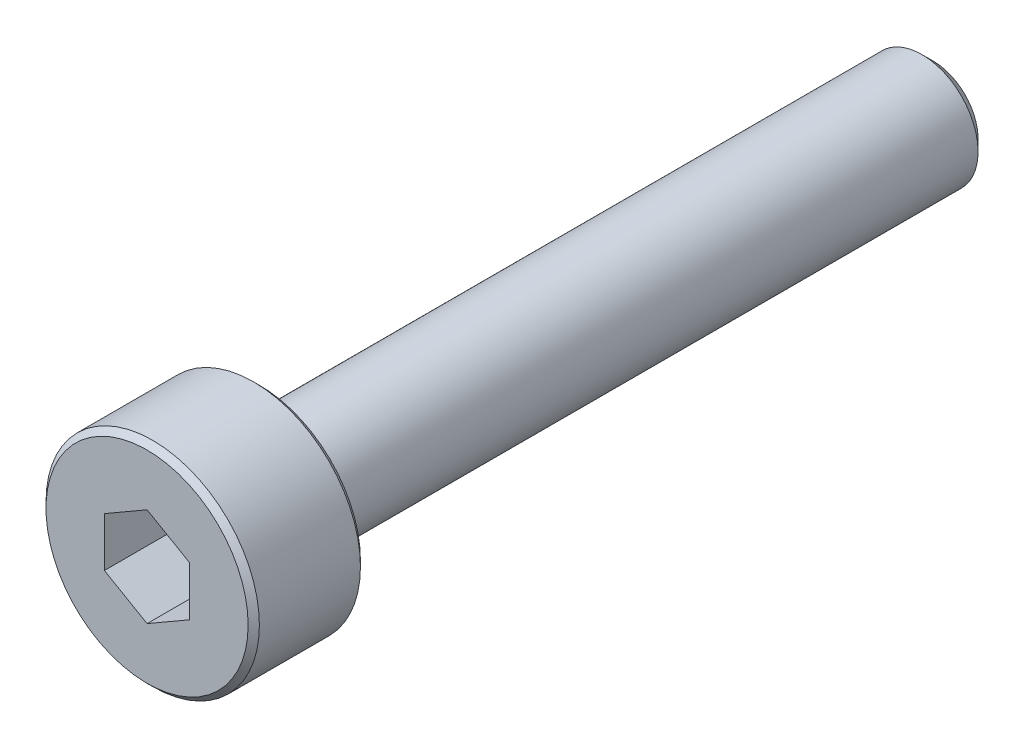
ISO-10303-21;
HEADER;
FILE_DESCRIPTION(('STEP AP214'),'2;1');
FILE_NAME('part.step','',(''),(''),'','','');
FILE_SCHEMA(('AUTOMOTIVE_DESIGN { 1 0 10303 214 1 1 1 1 }'));
ENDSEC;
DATA;
#1=APPLICATION_CONTEXT('core data for automotive mechanical design processes');
#2=APPLICATION_PROTOCOL_DEFINITION('international standard','automotive_design',2000,#1);
#3=PRODUCT_CONTEXT('',#1,'mechanical');
#4=PRODUCT('Part','Part','',(#3));
#5=PRODUCT_RELATED_PRODUCT_CATEGORY('part','',(#4));
#6=PRODUCT_DEFINITION_FORMATION('','',#4);
#7=PRODUCT_DEFINITION_CONTEXT('part definition',#1,'design');
#8=PRODUCT_DEFINITION('design','',#6,#7);
#9=PRODUCT_DEFINITION_SHAPE('','',#8);
#10=(LENGTH_UNIT() NAMED_UNIT(*) SI_UNIT(.MILLI.,.METRE.));
#11=(NAMED_UNIT(*) PLANE_ANGLE_UNIT() SI_UNIT($,.RADIAN.));
#12=(NAMED_UNIT(*) SI_UNIT($,.STERADIAN.) SOLID_ANGLE_UNIT());
#13=UNCERTAINTY_MEASURE_WITH_UNIT(LENGTH_MEASURE(1.E-05),#10,'distance_accuracy_value','');
#14=(GEOMETRIC_REPRESENTATION_CONTEXT(3) GLOBAL_UNCERTAINTY_ASSIGNED_CONTEXT((#13)) GLOBAL_UNIT_ASSIGNED_CONTEXT((#10,
#11,#12)) REPRESENTATION_CONTEXT('',''));
#15=CARTESIAN_POINT('',(0.,0.,0.));
#16=DIRECTION('',(0.,0.,1.));
#17=DIRECTION('',(1.,0.,0.));
#18=AXIS2_PLACEMENT_3D('',#15,#16,#17);
#19=CARTESIAN_POINT('',(0.,0.,10.));
#20=DIRECTION('',(0.,0.,1.));
#21=DIRECTION('',(1.,0.,0.));
#22=AXIS2_PLACEMENT_3D('',#19,#20,#21);
#23=CYLINDRICAL_SURFACE('',#22,1.9);
#24=CARTESIAN_POINT('',(0.,0.,10.1000007633703));
#25=DIRECTION('',(0.,0.,-1.));
#26=DIRECTION('',(-1.,0.,0.));
#27=AXIS2_PLACEMENT_3D('',#24,#25,#26);
#28=CIRCLE('',#27,1.9);
#29=CARTESIAN_POINT('',(1.9,0.,10.1000007633703));
#30=VERTEX_POINT('',#29);
#31=EDGE_CURVE('E151',#30,#30,#28,.F.);
#32=ORIENTED_EDGE('',*,*,#31,.T.);
#33=EDGE_LOOP('',(#32));
#34=FACE_BOUND('',#33,.T.);
#35=CARTESIAN_POINT('',(0.,0.,11.8999991776262));
#36=DIRECTION('',(0.,0.,1.));
#37=DIRECTION('',(1.,0.,0.));
#38=AXIS2_PLACEMENT_3D('',#35,#36,#37);
#39=CIRCLE('',#38,1.9);
#40=CARTESIAN_POINT('',(1.9,0.,11.8999991776262));
#41=VERTEX_POINT('',#40);
#42=EDGE_CURVE('E148',#41,#41,#39,.F.);
#43=ORIENTED_EDGE('',*,*,#42,.T.);
#44=EDGE_LOOP('',(#43));
#45=FACE_BOUND('',#44,.T.);
#46=ADVANCED_FACE('F37',(#34,#45),#23,.T.);
#47=CARTESIAN_POINT('',(1.9,0.,10.));
#48=DIRECTION('',(0.,0.,-1.));
#49=DIRECTION('',(-1.,0.,0.));
#50=AXIS2_PLACEMENT_3D('',#47,#48,#49);
#51=PLANE('',#50);
#52=CARTESIAN_POINT('',(0.,0.,10.));
#53=DIRECTION('',(0.,0.,-1.));
#54=DIRECTION('',(-1.,0.,0.));
#55=AXIS2_PLACEMENT_3D('',#52,#53,#54);
#56=CIRCLE('',#55,1.79999917762622);
#57=CARTESIAN_POINT('',(1.79999917762622,0.,10.));
#58=VERTEX_POINT('',#57);
#59=EDGE_CURVE('E154',#58,#58,#56,.T.);
#60=ORIENTED_EDGE('',*,*,#59,.T.);
#61=EDGE_LOOP('',(#60));
#62=FACE_BOUND('',#61,.T.);
#63=CARTESIAN_POINT('',(0.,0.,10.));
#64=DIRECTION('',(0.,0.,-1.));
#65=DIRECTION('',(-1.,0.,0.));
#66=AXIS2_PLACEMENT_3D('',#63,#64,#65);
#67=CIRCLE('',#66,1.);
#68=CARTESIAN_POINT('',(-1.,0.,10.));
#69=VERTEX_POINT('',#68);
#70=EDGE_CURVE('E140',#69,#69,#67,.T.);
#71=ORIENTED_EDGE('',*,*,#70,.F.);
#72=EDGE_LOOP('',(#71));
#73=FACE_BOUND('',#72,.T.);
#74=ADVANCED_FACE('F174',(#62,#73),#51,.T.);
#75=CARTESIAN_POINT('',(0.,0.,12.));
#76=DIRECTION('',(0.,0.,1.));
#77=DIRECTION('',(1.,0.,0.));
#78=AXIS2_PLACEMENT_3D('',#75,#76,#77);
#79=PLANE('',#78);
#80=CARTESIAN_POINT('',(0.,0.,12.));
#81=DIRECTION('',(0.,0.,1.));
#82=DIRECTION('',(1.,0.,0.));
#83=AXIS2_PLACEMENT_3D('',#80,#81,#82);
#84=CIRCLE('',#83,1.79999923662968);
#85=CARTESIAN_POINT('',(1.79999923662968,0.,12.));
#86=VERTEX_POINT('',#85);
#87=EDGE_CURVE('E157',#86,#86,#84,.T.);
#88=ORIENTED_EDGE('',*,*,#87,.T.);
#89=EDGE_LOOP('',(#88));
#90=FACE_BOUND('',#89,.T.);
#91=DIRECTION('',(0.,-1.,0.));
#92=VECTOR('',#91,1.);
#93=CARTESIAN_POINT('',(-0.759999999999996,0.438786204584093,12.));
#94=LINE('',#93,#92);
#95=CARTESIAN_POINT('',(-0.759999999999996,0.438786204584093,12.));
#96=VERTEX_POINT('',#95);
#97=CARTESIAN_POINT('',(-0.76,-0.4387862045841,12.));
#98=VERTEX_POINT('',#97);
#99=EDGE_CURVE('E53',#96,#98,#94,.T.);
#100=ORIENTED_EDGE('',*,*,#99,.F.);
#101=DIRECTION('',(-0.866025403784438,-0.500000000000002,0.));
#102=VECTOR('',#101,1.);
#103=CARTESIAN_POINT('',(0.,0.877572409168213,12.));
#104=LINE('',#103,#102);
#105=CARTESIAN_POINT('',(0.,0.877572409168213,12.));
#106=VERTEX_POINT('',#105);
#107=EDGE_CURVE('E136',#106,#96,#104,.T.);
#108=ORIENTED_EDGE('',*,*,#107,.F.);
#109=DIRECTION('',(-0.866025403784438,0.500000000000002,0.));
#110=VECTOR('',#109,1.);
#111=CARTESIAN_POINT('',(0.76,0.4387862045841,12.));
#112=LINE('',#111,#110);
#113=CARTESIAN_POINT('',(0.76,0.4387862045841,12.));
#114=VERTEX_POINT('',#113);
#115=EDGE_CURVE('E134',#114,#106,#112,.T.);
#116=ORIENTED_EDGE('',*,*,#115,.F.);
#117=DIRECTION('',(0.,1.,0.));
#118=VECTOR('',#117,1.);
#119=CARTESIAN_POINT('',(0.759999999999996,-0.438786204584093,12.));
#120=LINE('',#119,#118);
#121=CARTESIAN_POINT('',(0.759999999999996,-0.438786204584093,12.));
#122=VERTEX_POINT('',#121);
#123=EDGE_CURVE('E101',#122,#114,#120,.T.);
#124=ORIENTED_EDGE('',*,*,#123,.F.);
#125=DIRECTION('',(0.86602540378444,0.499999999999998,0.));
#126=VECTOR('',#125,1.);
#127=CARTESIAN_POINT('',(0.,-0.877572409168207,12.));
#128=LINE('',#127,#126);
#129=CARTESIAN_POINT('',(0.,-0.877572409168207,12.));
#130=VERTEX_POINT('',#129);
#131=EDGE_CURVE('E130',#130,#122,#128,.T.);
#132=ORIENTED_EDGE('',*,*,#131,.F.);
#133=DIRECTION('',(0.866025403784442,-0.499999999999994,0.));
#134=VECTOR('',#133,1.);
#135=CARTESIAN_POINT('',(-0.76,-0.4387862045841,12.));
#136=LINE('',#135,#134);
#137=EDGE_CURVE('E127',#98,#130,#136,.T.);
#138=ORIENTED_EDGE('',*,*,#137,.F.);
#139=EDGE_LOOP('',(#100,#108,#116,#124,#132,#138));
#140=FACE_BOUND('',#139,.T.);
#141=ADVANCED_FACE('F180',(#90,#140),#79,.T.);
#142=CARTESIAN_POINT('',(0.,0.,-2.));
#143=DIRECTION('',(0.,0.,1.));
#144=DIRECTION('',(1.,0.,0.));
#145=AXIS2_PLACEMENT_3D('',#142,#143,#144);
#146=CYLINDRICAL_SURFACE('',#145,1.);
#147=CARTESIAN_POINT('',(0.,0.,-1.79998954454024));
#148=DIRECTION('',(0.,0.,-1.));
#149=DIRECTION('',(-1.,0.,0.));
#150=AXIS2_PLACEMENT_3D('',#147,#148,#149);
#151=CIRCLE('',#150,1.);
#152=CARTESIAN_POINT('',(-1.,0.,-1.79998954454024));
#153=VERTEX_POINT('',#152);
#154=EDGE_CURVE('E11',#153,#153,#151,.F.);
#155=ORIENTED_EDGE('',*,*,#154,.T.);
#156=EDGE_LOOP('',(#155));
#157=FACE_BOUND('',#156,.T.);
#158=ORIENTED_EDGE('',*,*,#70,.T.);
#159=EDGE_LOOP('',(#158));
#160=FACE_BOUND('',#159,.T.);
#161=ADVANCED_FACE('F207',(#157,#160),#146,.T.);
#162=CARTESIAN_POINT('',(0.,0.,-2.));
#163=DIRECTION('',(0.,0.,-1.));
#164=DIRECTION('',(-1.,0.,0.));
#165=AXIS2_PLACEMENT_3D('',#162,#163,#164);
#166=PLANE('',#165);
#167=CARTESIAN_POINT('',(0.,0.,-2.));
#168=DIRECTION('',(0.,0.,-1.));
#169=DIRECTION('',(-1.,0.,0.));
#170=AXIS2_PLACEMENT_3D('',#167,#168,#169);
#171=CIRCLE('',#170,0.799991635727205);
#172=CARTESIAN_POINT('',(-0.799991635727205,0.,-2.));
#173=VERTEX_POINT('',#172);
#174=EDGE_CURVE('E46',#173,#173,#171,.T.);
#175=ORIENTED_EDGE('',*,*,#174,.T.);
#176=EDGE_LOOP('',(#175));
#177=FACE_BOUND('',#176,.T.);
#178=ADVANCED_FACE('F162',(#177),#166,.T.);
#179=CARTESIAN_POINT('',(-0.759999999999996,0.438786204584093,10.5));
#180=DIRECTION('',(-1.,0.,0.));
#181=DIRECTION('',(0.,-1.,0.));
#182=AXIS2_PLACEMENT_3D('',#179,#180,#181);
#183=PLANE('',#182);
#184=ORIENTED_EDGE('',*,*,#99,.T.);
#185=DIRECTION('',(0.,0.,1.));
#186=VECTOR('',#185,1.);
#187=CARTESIAN_POINT('',(-0.76,-0.4387862045841,10.5));
#188=LINE('',#187,#186);
#189=CARTESIAN_POINT('',(-0.76,-0.4387862045841,10.5));
#190=VERTEX_POINT('',#189);
#191=EDGE_CURVE('E83',#190,#98,#188,.T.);
#192=ORIENTED_EDGE('',*,*,#191,.F.);
#193=DIRECTION('',(0.,-1.,0.));
#194=VECTOR('',#193,1.);
#195=CARTESIAN_POINT('',(-0.759999999999996,0.438786204584093,10.5));
#196=LINE('',#195,#194);
#197=CARTESIAN_POINT('',(-0.759999999999996,0.438786204584093,10.5));
#198=VERTEX_POINT('',#197);
#199=EDGE_CURVE('E138',#198,#190,#196,.T.);
#200=ORIENTED_EDGE('',*,*,#199,.F.);
#201=DIRECTION('',(0.,0.,1.));
#202=VECTOR('',#201,1.);
#203=CARTESIAN_POINT('',(-0.759999999999996,0.438786204584093,10.5));
#204=LINE('',#203,#202);
#205=EDGE_CURVE('E61',#198,#96,#204,.T.);
#206=ORIENTED_EDGE('',*,*,#205,.T.);
#207=EDGE_LOOP('',(#184,#192,#200,#206));
#208=FACE_BOUND('',#207,.T.);
#209=ADVANCED_FACE('F215',(#208),#183,.F.);
#210=CARTESIAN_POINT('',(0.,0.877572409168213,10.5));
#211=DIRECTION('',(-0.500000000000002,0.866025403784438,0.));
#212=DIRECTION('',(-0.866025403784438,-0.500000000000002,0.));
#213=AXIS2_PLACEMENT_3D('',#210,#211,#212);
#214=PLANE('',#213);
#215=ORIENTED_EDGE('',*,*,#107,.T.);
#216=ORIENTED_EDGE('',*,*,#205,.F.);
#217=DIRECTION('',(-0.866025403784438,-0.500000000000002,0.));
#218=VECTOR('',#217,1.);
#219=CARTESIAN_POINT('',(0.,0.877572409168213,10.5));
#220=LINE('',#219,#218);
#221=CARTESIAN_POINT('',(0.,0.877572409168213,10.5));
#222=VERTEX_POINT('',#221);
#223=EDGE_CURVE('E113',#222,#198,#220,.T.);
#224=ORIENTED_EDGE('',*,*,#223,.F.);
#225=DIRECTION('',(0.,0.,1.));
#226=VECTOR('',#225,1.);
#227=CARTESIAN_POINT('',(0.,0.877572409168213,10.5));
#228=LINE('',#227,#226);
#229=EDGE_CURVE('E105',#222,#106,#228,.T.);
#230=ORIENTED_EDGE('',*,*,#229,.T.);
#231=EDGE_LOOP('',(#215,#216,#224,#230));
#232=FACE_BOUND('',#231,.T.);
#233=ADVANCED_FACE('F221',(#232),#214,.F.);
#234=CARTESIAN_POINT('',(0.76,0.4387862045841,10.5));
#235=DIRECTION('',(0.500000000000002,0.866025403784438,0.));
#236=DIRECTION('',(-0.866025403784438,0.500000000000002,0.));
#237=AXIS2_PLACEMENT_3D('',#234,#235,#236);
#238=PLANE('',#237);
#239=ORIENTED_EDGE('',*,*,#115,.T.);
#240=ORIENTED_EDGE('',*,*,#229,.F.);
#241=DIRECTION('',(-0.866025403784438,0.500000000000002,0.));
#242=VECTOR('',#241,1.);
#243=CARTESIAN_POINT('',(0.76,0.4387862045841,10.5));
#244=LINE('',#243,#242);
#245=CARTESIAN_POINT('',(0.76,0.4387862045841,10.5));
#246=VERTEX_POINT('',#245);
#247=EDGE_CURVE('E109',#246,#222,#244,.T.);
#248=ORIENTED_EDGE('',*,*,#247,.F.);
#249=DIRECTION('',(0.,0.,1.));
#250=VECTOR('',#249,1.);
#251=CARTESIAN_POINT('',(0.76,0.4387862045841,10.5));
#252=LINE('',#251,#250);
#253=EDGE_CURVE('E94',#246,#114,#252,.T.);
#254=ORIENTED_EDGE('',*,*,#253,.T.);
#255=EDGE_LOOP('',(#239,#240,#248,#254));
#256=FACE_BOUND('',#255,.T.);
#257=ADVANCED_FACE('F110',(#256),#238,.F.);
#258=CARTESIAN_POINT('',(0.759999999999996,-0.438786204584093,10.5));
#259=DIRECTION('',(1.,0.,0.));
#260=DIRECTION('',(0.,1.,0.));
#261=AXIS2_PLACEMENT_3D('',#258,#259,#260);
#262=PLANE('',#261);
#263=ORIENTED_EDGE('',*,*,#123,.T.);
#264=ORIENTED_EDGE('',*,*,#253,.F.);
#265=DIRECTION('',(0.,1.,0.));
#266=VECTOR('',#265,1.);
#267=CARTESIAN_POINT('',(0.759999999999996,-0.438786204584093,10.5));
#268=LINE('',#267,#266);
#269=CARTESIAN_POINT('',(0.759999999999996,-0.438786204584093,10.5));
#270=VERTEX_POINT('',#269);
#271=EDGE_CURVE('E98',#270,#246,#268,.T.);
#272=ORIENTED_EDGE('',*,*,#271,.F.);
#273=DIRECTION('',(0.,0.,1.));
#274=VECTOR('',#273,1.);
#275=CARTESIAN_POINT('',(0.759999999999996,-0.438786204584093,10.5));
#276=LINE('',#275,#274);
#277=EDGE_CURVE('E106',#270,#122,#276,.T.);
#278=ORIENTED_EDGE('',*,*,#277,.T.);
#279=EDGE_LOOP('',(#263,#264,#272,#278));
#280=FACE_BOUND('',#279,.T.);
#281=ADVANCED_FACE('F96',(#280),#262,.F.);
#282=CARTESIAN_POINT('',(0.,-0.877572409168207,10.5));
#283=DIRECTION('',(0.499999999999998,-0.86602540378444,0.));
#284=DIRECTION('',(0.86602540378444,0.499999999999998,0.));
#285=AXIS2_PLACEMENT_3D('',#282,#283,#284);
#286=PLANE('',#285);
#287=ORIENTED_EDGE('',*,*,#131,.T.);
#288=ORIENTED_EDGE('',*,*,#277,.F.);
#289=DIRECTION('',(0.86602540378444,0.499999999999998,0.));
#290=VECTOR('',#289,1.);
#291=CARTESIAN_POINT('',(0.,-0.877572409168207,10.5));
#292=LINE('',#291,#290);
#293=CARTESIAN_POINT('',(0.,-0.877572409168207,10.5));
#294=VERTEX_POINT('',#293);
#295=EDGE_CURVE('E119',#294,#270,#292,.T.);
#296=ORIENTED_EDGE('',*,*,#295,.F.);
#297=DIRECTION('',(0.,0.,1.));
#298=VECTOR('',#297,1.);
#299=CARTESIAN_POINT('',(0.,-0.877572409168207,10.5));
#300=LINE('',#299,#298);
#301=EDGE_CURVE('E143',#294,#130,#300,.T.);
#302=ORIENTED_EDGE('',*,*,#301,.T.);
#303=EDGE_LOOP('',(#287,#288,#296,#302));
#304=FACE_BOUND('',#303,.T.);
#305=ADVANCED_FACE('F224',(#304),#286,.F.);
#306=CARTESIAN_POINT('',(-0.76,-0.4387862045841,10.5));
#307=DIRECTION('',(-0.499999999999994,-0.866025403784442,0.));
#308=DIRECTION('',(0.866025403784442,-0.499999999999994,0.));
#309=AXIS2_PLACEMENT_3D('',#306,#307,#308);
#310=PLANE('',#309);
#311=ORIENTED_EDGE('',*,*,#137,.T.);
#312=ORIENTED_EDGE('',*,*,#301,.F.);
#313=DIRECTION('',(0.866025403784442,-0.499999999999994,0.));
#314=VECTOR('',#313,1.);
#315=CARTESIAN_POINT('',(-0.76,-0.4387862045841,10.5));
#316=LINE('',#315,#314);
#317=EDGE_CURVE('E121',#190,#294,#316,.T.);
#318=ORIENTED_EDGE('',*,*,#317,.F.);
#319=ORIENTED_EDGE('',*,*,#191,.T.);
#320=EDGE_LOOP('',(#311,#312,#318,#319));
#321=FACE_BOUND('',#320,.T.);
#322=ADVANCED_FACE('F199',(#321),#310,.F.);
#323=CARTESIAN_POINT('',(0.,0.,10.5));
#324=DIRECTION('',(0.,0.,1.));
#325=DIRECTION('',(1.,0.,0.));
#326=AXIS2_PLACEMENT_3D('',#323,#324,#325);
#327=PLANE('',#326);
#328=ORIENTED_EDGE('',*,*,#199,.T.);
#329=ORIENTED_EDGE('',*,*,#317,.T.);
#330=ORIENTED_EDGE('',*,*,#295,.T.);
#331=ORIENTED_EDGE('',*,*,#271,.T.);
#332=ORIENTED_EDGE('',*,*,#247,.T.);
#333=ORIENTED_EDGE('',*,*,#223,.T.);
#334=EDGE_LOOP('',(#328,#329,#330,#331,#332,#333));
#335=FACE_BOUND('',#334,.T.);
#336=ADVANCED_FACE('F116',(#335),#327,.T.);
#337=CARTESIAN_POINT('',(0.,0.,10.1000007633703));
#338=DIRECTION('',(0.,0.,1.));
#339=DIRECTION('',(1.,0.,0.));
#340=AXIS2_PLACEMENT_3D('',#337,#338,#339);
#341=CONICAL_SURFACE('',#340,1.9,0.785398458412441);
#342=CARTESIAN_POINT('',(1.79999917762622,0.,10.));
#343=CARTESIAN_POINT('',(1.80104085285928,0.,10.0010416746184));
#344=CARTESIAN_POINT('',(1.80208252809234,0.,10.0020833492369));
#345=CARTESIAN_POINT('',(1.80416587855846,0.,10.0041666984738));
#346=CARTESIAN_POINT('',(1.80520755379152,0.,10.0052083730922));
#347=CARTESIAN_POINT('',(1.80729090425764,0.,10.0072917223291));
#348=CARTESIAN_POINT('',(1.8083325794907,0.,10.0083333969475));
#349=CARTESIAN_POINT('',(1.81041592995682,0.,10.0104167461844));
#350=CARTESIAN_POINT('',(1.81145760518988,0.,10.0114584208028));
#351=CARTESIAN_POINT('',(1.813540955656,0.,10.0135417700397));
#352=CARTESIAN_POINT('',(1.81458263088906,0.,10.0145834446582));
#353=CARTESIAN_POINT('',(1.81666598135518,0.,10.0166667938951));
#354=CARTESIAN_POINT('',(1.81770765658824,0.,10.0177084685135));
#355=CARTESIAN_POINT('',(1.81979100705436,0.,10.0197918177504));
#356=CARTESIAN_POINT('',(1.82083268228742,0.,10.0208334923688));
#357=CARTESIAN_POINT('',(1.82291603275354,0.,10.0229168416057));
#358=CARTESIAN_POINT('',(1.8239577079866,0.,10.0239585162241));
#359=CARTESIAN_POINT('',(1.82604105845272,0.,10.026041865461));
#360=CARTESIAN_POINT('',(1.82708273368578,0.,10.0270835400795));
#361=CARTESIAN_POINT('',(1.8291660841519,0.,10.0291668893163));
#362=CARTESIAN_POINT('',(1.83020775938496,0.,10.0302085639348));
#363=CARTESIAN_POINT('',(1.83229110985108,0.,10.0322919131717));
#364=CARTESIAN_POINT('',(1.83333278508414,0.,10.0333335877901));
#365=CARTESIAN_POINT('',(1.83541613555027,0.,10.035416937027));
#366=CARTESIAN_POINT('',(1.83645781078333,0.,10.0364586116454));
#367=CARTESIAN_POINT('',(1.83854116124945,0.,10.0385419608823));
#368=CARTESIAN_POINT('',(1.83958283648251,0.,10.0395836355008));
#369=CARTESIAN_POINT('',(1.84166618694863,0.,10.0416669847376));
#370=CARTESIAN_POINT('',(1.84270786218169,0.,10.0427086593561));
#371=CARTESIAN_POINT('',(1.84479121264781,0.,10.044792008593));
#372=CARTESIAN_POINT('',(1.84583288788087,0.,10.0458336832114));
#373=CARTESIAN_POINT('',(1.84791623834699,0.,10.0479170324483));
#374=CARTESIAN_POINT('',(1.84895791358005,0.,10.0489587070667));
#375=CARTESIAN_POINT('',(1.85104126404617,0.,10.0510420563036));
#376=CARTESIAN_POINT('',(1.85208293927923,0.,10.052083730922));
#377=CARTESIAN_POINT('',(1.85416628974535,0.,10.0541670801589));
#378=CARTESIAN_POINT('',(1.85520796497841,0.,10.0552087547774));
#379=CARTESIAN_POINT('',(1.85729131544453,0.,10.0572921040142));
#380=CARTESIAN_POINT('',(1.85833299067759,0.,10.0583337786327));
#381=CARTESIAN_POINT('',(1.86041634114371,0.,10.0604171278696));
#382=CARTESIAN_POINT('',(1.86145801637677,0.,10.061458802488));
#383=CARTESIAN_POINT('',(1.86354136684289,0.,10.0635421517249));
#384=CARTESIAN_POINT('',(1.86458304207595,0.,10.0645838263433));
#385=CARTESIAN_POINT('',(1.86666639254207,0.,10.0666671755802));
#386=CARTESIAN_POINT('',(1.86770806777513,0.,10.0677088501987));
#387=CARTESIAN_POINT('',(1.86979141824125,0.,10.0697921994355));
#388=CARTESIAN_POINT('',(1.87083309347431,0.,10.070833874054));
#389=CARTESIAN_POINT('',(1.87291644394043,0.,10.0729172232909));
#390=CARTESIAN_POINT('',(1.87395811917349,0.,10.0739588979093));
#391=CARTESIAN_POINT('',(1.87604146963962,0.,10.0760422471462));
#392=CARTESIAN_POINT('',(1.87708314487268,0.,10.0770839217646));
#393=CARTESIAN_POINT('',(1.8791664953388,0.,10.0791672710015));
#394=CARTESIAN_POINT('',(1.88020817057186,0.,10.0802089456199));
#395=CARTESIAN_POINT('',(1.88229152103798,0.,10.0822922948568));
#396=CARTESIAN_POINT('',(1.88333319627104,0.,10.0833339694753));
#397=CARTESIAN_POINT('',(1.88541654673716,0.,10.0854173187121));
#398=CARTESIAN_POINT('',(1.88645822197022,0.,10.0864589933306));
#399=CARTESIAN_POINT('',(1.88854157243634,0.,10.0885423425675));
#400=CARTESIAN_POINT('',(1.8895832476694,0.,10.0895840171859));
#401=CARTESIAN_POINT('',(1.89166659813552,0.,10.0916673664228));
#402=CARTESIAN_POINT('',(1.89270827336858,0.,10.0927090410412));
#403=CARTESIAN_POINT('',(1.8947916238347,0.,10.0947923902781));
#404=CARTESIAN_POINT('',(1.89583329906776,0.,10.0958340648966));
#405=CARTESIAN_POINT('',(1.89791664953388,0.,10.0979174141334));
#406=CARTESIAN_POINT('',(1.89895832476694,0.,10.0989590887519));
#407=CARTESIAN_POINT('',(1.9,0.,10.1000007633703));
#408=B_SPLINE_CURVE_WITH_KNOTS('',3,(#342,#343,#344,#345,#346,#347,#348,#349,#350,#351,#352,
#353,#354,#355,#356,#357,#358,#359,#360,#361,#362,#363,#364,#365,#366,#367,#368,#369,#370,#371,
#372,#373,#374,#375,#376,#377,#378,#379,#380,#381,#382,#383,#384,#385,#386,#387,#388,#389,#390,
#391,#392,#393,#394,#395,#396,#397,#398,#399,#400,#401,#402,#403,#404,#405,#406,#407),
.UNSPECIFIED.,.F.,.F.,(4,2,2,2,2,2,2,2,2,2,2,2,2,2,2,2,2,2,2,2,2,2,2,2,2,2,2,2,2,2,2,2,4),(0.,
0.00441945242274217,0.00883890484548312,0.0132583572682241,0.0176778096909662,
0.0220972621137073,0.0265167145364483,0.0309361669591905,0.0353556193819314,0.0397750718046723,
0.0441945242274145,0.0486139766501556,0.0530334290728966,0.0574528814956387,0.0618723339183797,
0.0662917863411206,0.0707112387638616,0.0751306911866039,0.0795501436093449,0.0839695960320858,
0.088389048454828,0.0928085008775689,0.0972279533003099,0.101647405723052,0.106066858145793,
0.110486310568534,0.114905762991276,0.119325215414017,0.123744667836758,0.128164120259501,
0.132583572682241,0.137003025104982,0.141422477527723),.UNSPECIFIED.);
#409=EDGE_CURVE('BSEAM170',#58,#30,#408,.T.);
#410=ORIENTED_EDGE('',*,*,#59,.F.);
#411=ORIENTED_EDGE('',*,*,#31,.F.);
#412=ORIENTED_EDGE('',*,*,#409,.T.);
#413=ORIENTED_EDGE('',*,*,#409,.F.);
#414=EDGE_LOOP('',(#410,#412,#411,#413));
#415=FACE_BOUND('',#414,.T.);
#416=ADVANCED_FACE('F170',(#415),#341,.T.);
#417=CARTESIAN_POINT('',(0.,0.,12.));
#418=DIRECTION('',(0.,0.,-1.));
#419=DIRECTION('',(-1.,0.,0.));
#420=AXIS2_PLACEMENT_3D('',#417,#418,#419);
#421=CONICAL_SURFACE('',#420,1.79999923662968,0.785397868382449);
#422=ORIENTED_EDGE('',*,*,#42,.F.);
#423=EDGE_LOOP('',(#422));
#424=FACE_BOUND('',#423,.T.);
#425=ORIENTED_EDGE('',*,*,#87,.F.);
#426=EDGE_LOOP('',(#425));
#427=FACE_BOUND('',#426,.T.);
#428=ADVANCED_FACE('F165',(#424,#427),#421,.T.);
#429=CARTESIAN_POINT('',(0.,0.,-2.));
#430=DIRECTION('',(0.,0.,1.));
#431=DIRECTION('',(1.,0.,0.));
#432=AXIS2_PLACEMENT_3D('',#429,#430,#431);
#433=CONICAL_SURFACE('',#432,0.799991635727205,0.78539293567599);
#434=ORIENTED_EDGE('',*,*,#154,.F.);
#435=EDGE_LOOP('',(#434));
#436=FACE_BOUND('',#435,.T.);
#437=ORIENTED_EDGE('',*,*,#174,.F.);
#438=EDGE_LOOP('',(#437));
#439=FACE_BOUND('',#438,.T.);
#440=ADVANCED_FACE('F40',(#436,#439),#433,.T.);
#441=CLOSED_SHELL('',(#46,#74,#141,#161,#178,#209,#233,#257,#281,#305,#322,#336,#416,#428,#440));
#442=MANIFOLD_SOLID_BREP('B2',#441);
#443=ADVANCED_BREP_SHAPE_REPRESENTATION('',(#18,#442),#14);
#444=SHAPE_DEFINITION_REPRESENTATION(#9,#443);
ENDSEC;
END-ISO-10303-21;
